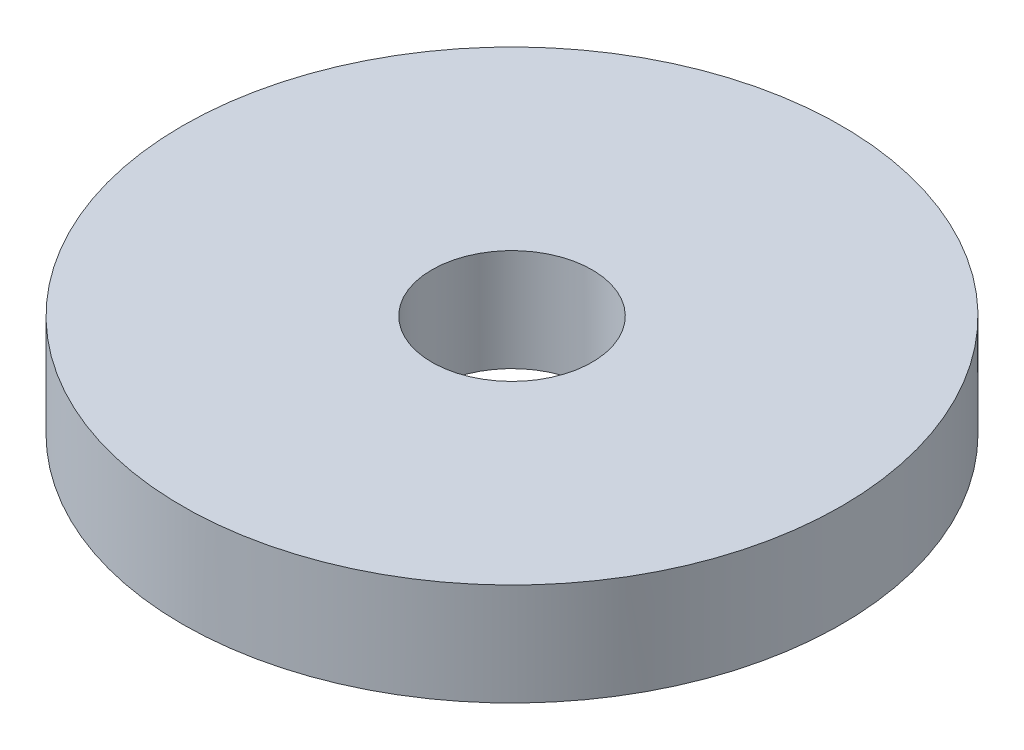
ISO-10303-21;
HEADER;
FILE_DESCRIPTION(('STEP AP214'),'2;1');
FILE_NAME('part.step','',(''),(''),'','','');
FILE_SCHEMA(('AUTOMOTIVE_DESIGN { 1 0 10303 214 1 1 1 1 }'));
ENDSEC;
DATA;
#1=APPLICATION_CONTEXT('core data for automotive mechanical design processes');
#2=APPLICATION_PROTOCOL_DEFINITION('international standard','automotive_design',2000,#1);
#3=PRODUCT_CONTEXT('',#1,'mechanical');
#4=PRODUCT('Part','Part','',(#3));
#5=PRODUCT_RELATED_PRODUCT_CATEGORY('part','',(#4));
#6=PRODUCT_DEFINITION_FORMATION('','',#4);
#7=PRODUCT_DEFINITION_CONTEXT('part definition',#1,'design');
#8=PRODUCT_DEFINITION('design','',#6,#7);
#9=PRODUCT_DEFINITION_SHAPE('','',#8);
#10=(LENGTH_UNIT() NAMED_UNIT(*) SI_UNIT(.MILLI.,.METRE.));
#11=(NAMED_UNIT(*) PLANE_ANGLE_UNIT() SI_UNIT($,.RADIAN.));
#12=(NAMED_UNIT(*) SI_UNIT($,.STERADIAN.) SOLID_ANGLE_UNIT());
#13=UNCERTAINTY_MEASURE_WITH_UNIT(LENGTH_MEASURE(1.E-05),#10,'distance_accuracy_value','');
#14=(GEOMETRIC_REPRESENTATION_CONTEXT(3) GLOBAL_UNCERTAINTY_ASSIGNED_CONTEXT((#13)) GLOBAL_UNIT_ASSIGNED_CONTEXT((#10,
#11,#12)) REPRESENTATION_CONTEXT('',''));
#15=CARTESIAN_POINT('',(0.,0.,0.));
#16=DIRECTION('',(0.,0.,1.));
#17=DIRECTION('',(1.,0.,0.));
#18=AXIS2_PLACEMENT_3D('',#15,#16,#17);
#19=CARTESIAN_POINT('',(0.,31.6214032818179,0.));
#20=DIRECTION('',(0.,-1.,0.));
#21=DIRECTION('',(0.,0.,-1.));
#22=AXIS2_PLACEMENT_3D('',#19,#20,#21);
#23=CYLINDRICAL_SURFACE('',#22,10.075);
#24=CARTESIAN_POINT('',(0.,0.,0.));
#25=DIRECTION('',(0.,1.,0.));
#26=DIRECTION('',(0.,0.,1.));
#27=AXIS2_PLACEMENT_3D('',#24,#25,#26);
#28=CIRCLE('',#27,10.075);
#29=CARTESIAN_POINT('',(0.,0.,10.075));
#30=VERTEX_POINT('',#29);
#31=EDGE_CURVE('E48',#30,#30,#28,.T.);
#32=ORIENTED_EDGE('',*,*,#31,.T.);
#33=EDGE_LOOP('',(#32));
#34=FACE_BOUND('',#33,.T.);
#35=CARTESIAN_POINT('',(0.,3.125,0.));
#36=DIRECTION('',(0.,1.,0.));
#37=DIRECTION('',(-1.,0.,0.));
#38=AXIS2_PLACEMENT_3D('',#35,#36,#37);
#39=CIRCLE('',#38,10.075);
#40=CARTESIAN_POINT('',(-10.075,3.12500000000001,0.));
#41=VERTEX_POINT('',#40);
#42=EDGE_CURVE('E10',#41,#41,#39,.T.);
#43=ORIENTED_EDGE('',*,*,#42,.F.);
#44=EDGE_LOOP('',(#43));
#45=FACE_BOUND('',#44,.T.);
#46=ADVANCED_FACE('F37',(#34,#45),#23,.T.);
#47=CARTESIAN_POINT('',(0.,0.,0.));
#48=DIRECTION('',(0.,1.,0.));
#49=DIRECTION('',(0.,0.,1.));
#50=AXIS2_PLACEMENT_3D('',#47,#48,#49);
#51=PLANE('',#50);
#52=ORIENTED_EDGE('',*,*,#31,.F.);
#53=EDGE_LOOP('',(#52));
#54=FACE_BOUND('',#53,.T.);
#55=CARTESIAN_POINT('',(0.,0.,0.));
#56=DIRECTION('',(0.,1.,0.));
#57=DIRECTION('',(0.,0.,1.));
#58=AXIS2_PLACEMENT_3D('',#55,#56,#57);
#59=CIRCLE('',#58,2.45);
#60=CARTESIAN_POINT('',(0.,0.,2.45));
#61=VERTEX_POINT('',#60);
#62=EDGE_CURVE('E50',#61,#61,#59,.T.);
#63=ORIENTED_EDGE('',*,*,#62,.T.);
#64=EDGE_LOOP('',(#63));
#65=FACE_BOUND('',#64,.T.);
#66=ADVANCED_FACE('F57',(#54,#65),#51,.F.);
#67=CARTESIAN_POINT('',(0.,31.6214032818179,0.));
#68=DIRECTION('',(0.,-1.,0.));
#69=DIRECTION('',(0.,0.,-1.));
#70=AXIS2_PLACEMENT_3D('',#67,#68,#69);
#71=CYLINDRICAL_SURFACE('',#70,2.45);
#72=ORIENTED_EDGE('',*,*,#62,.F.);
#73=EDGE_LOOP('',(#72));
#74=FACE_BOUND('',#73,.T.);
#75=CARTESIAN_POINT('',(0.,3.125,0.));
#76=DIRECTION('',(0.,1.,0.));
#77=DIRECTION('',(-1.,0.,0.));
#78=AXIS2_PLACEMENT_3D('',#75,#76,#77);
#79=CIRCLE('',#78,2.45);
#80=CARTESIAN_POINT('',(-2.45,3.125,0.));
#81=VERTEX_POINT('',#80);
#82=EDGE_CURVE('E40',#81,#81,#79,.T.);
#83=ORIENTED_EDGE('',*,*,#82,.T.);
#84=EDGE_LOOP('',(#83));
#85=FACE_BOUND('',#84,.T.);
#86=ADVANCED_FACE('F60',(#74,#85),#71,.F.);
#87=CARTESIAN_POINT('',(0.,3.125,0.));
#88=DIRECTION('',(0.,1.,0.));
#89=DIRECTION('',(-0.881929139451022,0.,-0.471382003249148));
#90=AXIS2_PLACEMENT_3D('',#87,#88,#89);
#91=PLANE('',#90);
#92=ORIENTED_EDGE('',*,*,#82,.F.);
#93=EDGE_LOOP('',(#92));
#94=FACE_BOUND('',#93,.T.);
#95=ORIENTED_EDGE('',*,*,#42,.T.);
#96=EDGE_LOOP('',(#95));
#97=FACE_BOUND('',#96,.T.);
#98=ADVANCED_FACE('F65',(#94,#97),#91,.T.);
#99=CLOSED_SHELL('',(#46,#66,#86,#98));
#100=MANIFOLD_SOLID_BREP('B2',#99);
#101=ADVANCED_BREP_SHAPE_REPRESENTATION('',(#18,#100),#14);
#102=SHAPE_DEFINITION_REPRESENTATION(#9,#101);
ENDSEC;
END-ISO-10303-21;
